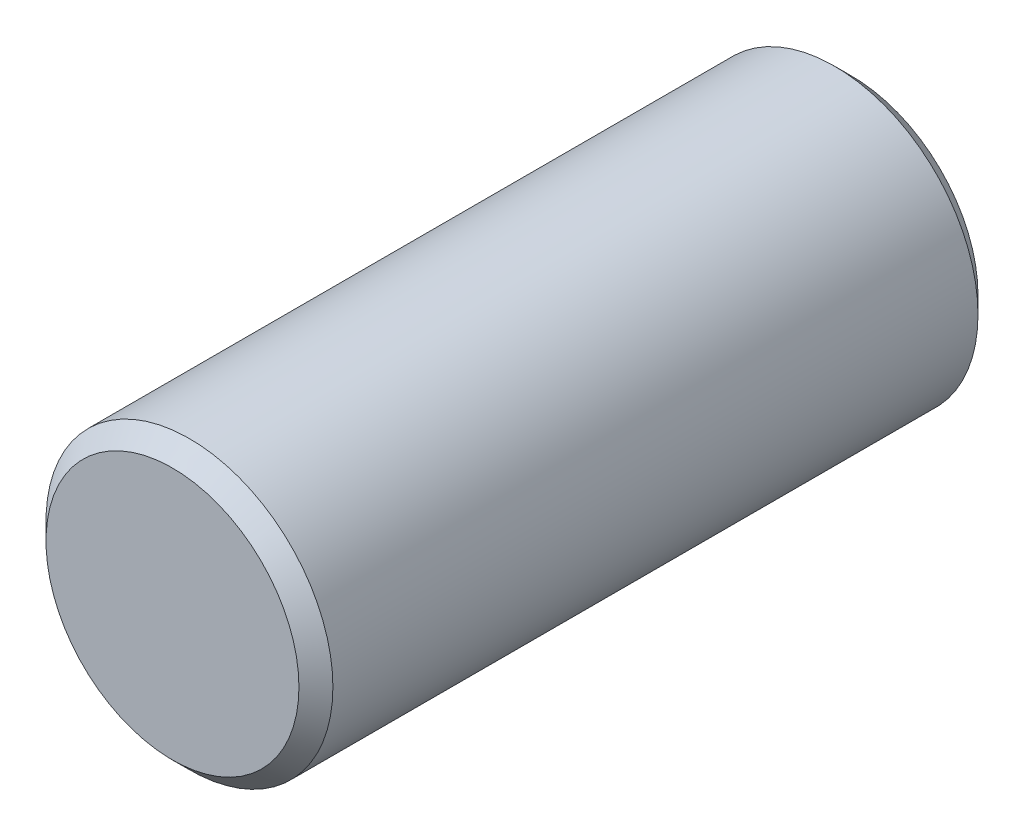
ISO-10303-21;
HEADER;
FILE_DESCRIPTION(('STEP AP214'),'2;1');
FILE_NAME('part.step','',(''),(''),'','','');
FILE_SCHEMA(('AUTOMOTIVE_DESIGN { 1 0 10303 214 1 1 1 1 }'));
ENDSEC;
DATA;
#1=APPLICATION_CONTEXT('core data for automotive mechanical design processes');
#2=APPLICATION_PROTOCOL_DEFINITION('international standard','automotive_design',2000,#1);
#3=PRODUCT_CONTEXT('',#1,'mechanical');
#4=PRODUCT('Part','Part','',(#3));
#5=PRODUCT_RELATED_PRODUCT_CATEGORY('part','',(#4));
#6=PRODUCT_DEFINITION_FORMATION('','',#4);
#7=PRODUCT_DEFINITION_CONTEXT('part definition',#1,'design');
#8=PRODUCT_DEFINITION('design','',#6,#7);
#9=PRODUCT_DEFINITION_SHAPE('','',#8);
#10=(LENGTH_UNIT() NAMED_UNIT(*) SI_UNIT(.MILLI.,.METRE.));
#11=(NAMED_UNIT(*) PLANE_ANGLE_UNIT() SI_UNIT($,.RADIAN.));
#12=(NAMED_UNIT(*) SI_UNIT($,.STERADIAN.) SOLID_ANGLE_UNIT());
#13=UNCERTAINTY_MEASURE_WITH_UNIT(LENGTH_MEASURE(1.E-05),#10,'distance_accuracy_value','');
#14=(GEOMETRIC_REPRESENTATION_CONTEXT(3) GLOBAL_UNCERTAINTY_ASSIGNED_CONTEXT((#13)) GLOBAL_UNIT_ASSIGNED_CONTEXT((#10,
#11,#12)) REPRESENTATION_CONTEXT('',''));
#15=CARTESIAN_POINT('',(0.,0.,0.));
#16=DIRECTION('',(0.,0.,1.));
#17=DIRECTION('',(1.,0.,0.));
#18=AXIS2_PLACEMENT_3D('',#15,#16,#17);
#19=CARTESIAN_POINT('',(0.,0.,80.));
#20=DIRECTION('',(0.,0.,-1.));
#21=DIRECTION('',(-1.,0.,0.));
#22=AXIS2_PLACEMENT_3D('',#19,#20,#21);
#23=CYLINDRICAL_SURFACE('',#22,16.9);
#24=CARTESIAN_POINT('',(0.,0.,1.99999999999999));
#25=DIRECTION('',(0.,0.,1.));
#26=DIRECTION('',(1.,0.,0.));
#27=AXIS2_PLACEMENT_3D('',#24,#25,#26);
#28=CIRCLE('',#27,16.9);
#29=CARTESIAN_POINT('',(16.9,0.,1.99999999999999));
#30=VERTEX_POINT('',#29);
#31=EDGE_CURVE('E56',#30,#30,#28,.T.);
#32=ORIENTED_EDGE('',*,*,#31,.T.);
#33=EDGE_LOOP('',(#32));
#34=FACE_BOUND('',#33,.T.);
#35=CARTESIAN_POINT('',(0.,0.,78.));
#36=DIRECTION('',(0.,0.,1.));
#37=DIRECTION('',(1.,0.,0.));
#38=AXIS2_PLACEMENT_3D('',#35,#36,#37);
#39=CIRCLE('',#38,16.9);
#40=CARTESIAN_POINT('',(16.9,0.,78.));
#41=VERTEX_POINT('',#40);
#42=EDGE_CURVE('E60',#41,#41,#39,.F.);
#43=ORIENTED_EDGE('',*,*,#42,.T.);
#44=EDGE_LOOP('',(#43));
#45=FACE_BOUND('',#44,.T.);
#46=ADVANCED_FACE('F44',(#34,#45),#23,.T.);
#47=CARTESIAN_POINT('',(0.,0.,80.));
#48=DIRECTION('',(0.,0.,1.));
#49=DIRECTION('',(1.,0.,0.));
#50=AXIS2_PLACEMENT_3D('',#47,#48,#49);
#51=PLANE('',#50);
#52=CARTESIAN_POINT('',(0.,0.,80.));
#53=DIRECTION('',(0.,0.,1.));
#54=DIRECTION('',(1.,0.,0.));
#55=AXIS2_PLACEMENT_3D('',#52,#53,#54);
#56=CIRCLE('',#55,14.9);
#57=CARTESIAN_POINT('',(14.9,0.,80.));
#58=VERTEX_POINT('',#57);
#59=EDGE_CURVE('E10',#58,#58,#56,.T.);
#60=ORIENTED_EDGE('',*,*,#59,.T.);
#61=EDGE_LOOP('',(#60));
#62=FACE_BOUND('',#61,.T.);
#63=ADVANCED_FACE('F76',(#62),#51,.T.);
#64=CARTESIAN_POINT('',(0.,0.,0.));
#65=DIRECTION('',(0.,0.,1.));
#66=DIRECTION('',(1.,0.,0.));
#67=AXIS2_PLACEMENT_3D('',#64,#65,#66);
#68=PLANE('',#67);
#69=CARTESIAN_POINT('',(0.,0.,0.));
#70=DIRECTION('',(0.,0.,1.));
#71=DIRECTION('',(1.,0.,0.));
#72=AXIS2_PLACEMENT_3D('',#69,#70,#71);
#73=CIRCLE('',#72,14.9);
#74=CARTESIAN_POINT('',(14.9,0.,0.));
#75=VERTEX_POINT('',#74);
#76=EDGE_CURVE('E52',#75,#75,#73,.F.);
#77=ORIENTED_EDGE('',*,*,#76,.T.);
#78=EDGE_LOOP('',(#77));
#79=FACE_BOUND('',#78,.T.);
#80=ADVANCED_FACE('F73',(#79),#68,.F.);
#81=CARTESIAN_POINT('',(0.,0.,1.99999999999999));
#82=DIRECTION('',(0.,0.,1.));
#83=DIRECTION('',(1.,0.,0.));
#84=AXIS2_PLACEMENT_3D('',#81,#82,#83);
#85=CONICAL_SURFACE('',#84,16.9,0.785398163397448);
#86=ORIENTED_EDGE('',*,*,#76,.F.);
#87=EDGE_LOOP('',(#86));
#88=FACE_BOUND('',#87,.T.);
#89=ORIENTED_EDGE('',*,*,#31,.F.);
#90=EDGE_LOOP('',(#89));
#91=FACE_BOUND('',#90,.T.);
#92=ADVANCED_FACE('F69',(#88,#91),#85,.T.);
#93=CARTESIAN_POINT('',(0.,0.,80.));
#94=DIRECTION('',(0.,0.,-1.));
#95=DIRECTION('',(-1.,0.,0.));
#96=AXIS2_PLACEMENT_3D('',#93,#94,#95);
#97=CONICAL_SURFACE('',#96,14.9,0.785398163397448);
#98=ORIENTED_EDGE('',*,*,#42,.F.);
#99=EDGE_LOOP('',(#98));
#100=FACE_BOUND('',#99,.T.);
#101=ORIENTED_EDGE('',*,*,#59,.F.);
#102=EDGE_LOOP('',(#101));
#103=FACE_BOUND('',#102,.T.);
#104=ADVANCED_FACE('F47',(#100,#103),#97,.T.);
#105=CLOSED_SHELL('',(#46,#63,#80,#92,#104));
#106=MANIFOLD_SOLID_BREP('B2',#105);
#107=ADVANCED_BREP_SHAPE_REPRESENTATION('',(#18,#106),#14);
#108=SHAPE_DEFINITION_REPRESENTATION(#9,#107);
ENDSEC;
END-ISO-10303-21;
